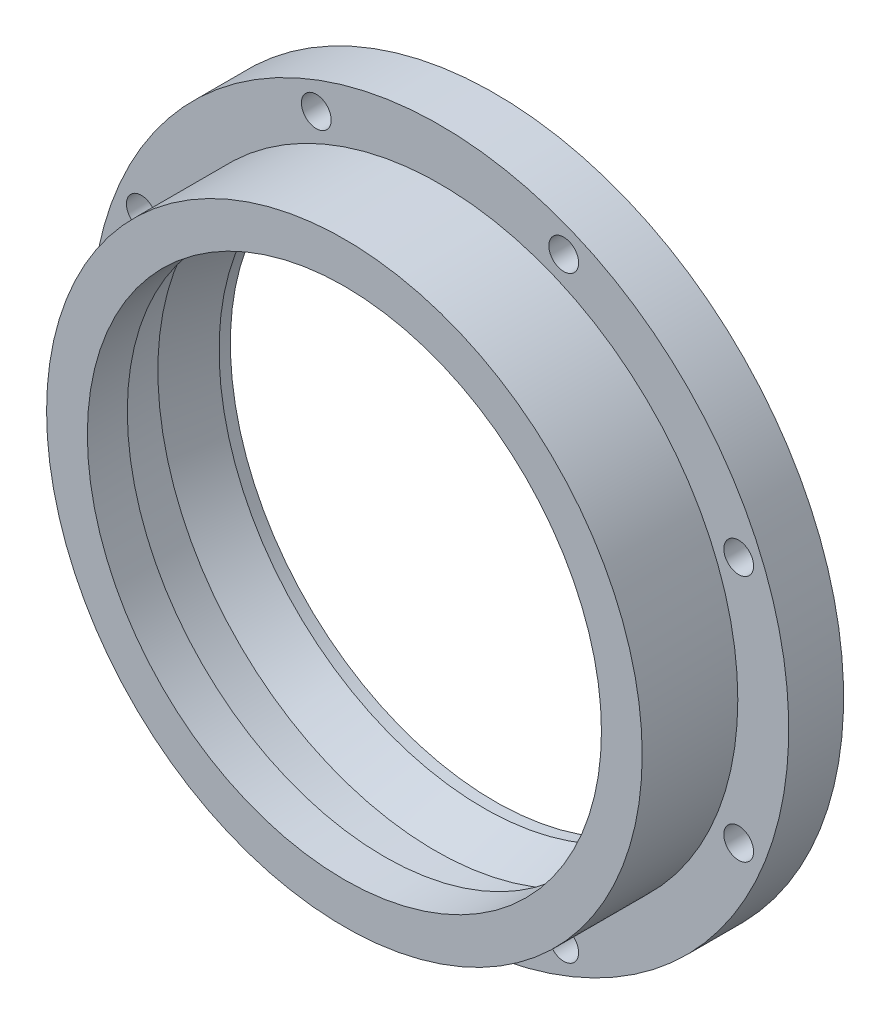
ISO-10303-21;
HEADER;
FILE_DESCRIPTION(('STEP AP214'),'2;1');
FILE_NAME('part.step','',(''),(''),'','','');
FILE_SCHEMA(('AUTOMOTIVE_DESIGN { 1 0 10303 214 1 1 1 1 }'));
ENDSEC;
DATA;
#1=APPLICATION_CONTEXT('core data for automotive mechanical design processes');
#2=APPLICATION_PROTOCOL_DEFINITION('international standard','automotive_design',2000,#1);
#3=PRODUCT_CONTEXT('',#1,'mechanical');
#4=PRODUCT('Part','Part','',(#3));
#5=PRODUCT_RELATED_PRODUCT_CATEGORY('part','',(#4));
#6=PRODUCT_DEFINITION_FORMATION('','',#4);
#7=PRODUCT_DEFINITION_CONTEXT('part definition',#1,'design');
#8=PRODUCT_DEFINITION('design','',#6,#7);
#9=PRODUCT_DEFINITION_SHAPE('','',#8);
#10=(LENGTH_UNIT() NAMED_UNIT(*) SI_UNIT(.MILLI.,.METRE.));
#11=(NAMED_UNIT(*) PLANE_ANGLE_UNIT() SI_UNIT($,.RADIAN.));
#12=(NAMED_UNIT(*) SI_UNIT($,.STERADIAN.) SOLID_ANGLE_UNIT());
#13=UNCERTAINTY_MEASURE_WITH_UNIT(LENGTH_MEASURE(1.E-05),#10,'distance_accuracy_value','');
#14=(GEOMETRIC_REPRESENTATION_CONTEXT(3) GLOBAL_UNCERTAINTY_ASSIGNED_CONTEXT((#13)) GLOBAL_UNIT_ASSIGNED_CONTEXT((#10,
#11,#12)) REPRESENTATION_CONTEXT('',''));
#15=CARTESIAN_POINT('',(0.,0.,0.));
#16=DIRECTION('',(0.,0.,1.));
#17=DIRECTION('',(1.,0.,0.));
#18=AXIS2_PLACEMENT_3D('',#15,#16,#17);
#19=CARTESIAN_POINT('',(41.656,0.,17.907));
#20=DIRECTION('',(0.,0.,1.));
#21=DIRECTION('',(1.,0.,0.));
#22=AXIS2_PLACEMENT_3D('',#19,#20,#21);
#23=PLANE('',#22);
#24=CARTESIAN_POINT('',(8.73989834802428E-13,0.,17.9070000000001));
#25=DIRECTION('',(0.,0.,1.));
#26=DIRECTION('',(1.,0.,0.));
#27=AXIS2_PLACEMENT_3D('',#24,#25,#26);
#28=CIRCLE('',#27,41.656);
#29=CARTESIAN_POINT('',(41.6560000000009,0.,17.907));
#30=VERTEX_POINT('',#29);
#31=EDGE_CURVE('E121',#30,#30,#28,.T.);
#32=ORIENTED_EDGE('',*,*,#31,.T.);
#33=EDGE_LOOP('',(#32));
#34=FACE_BOUND('',#33,.T.);
#35=CARTESIAN_POINT('',(9.66371887886218E-13,0.,17.9070000000001));
#36=DIRECTION('',(0.,0.,1.));
#37=DIRECTION('',(1.,0.,0.));
#38=AXIS2_PLACEMENT_3D('',#35,#36,#37);
#39=CIRCLE('',#38,43.18);
#40=CARTESIAN_POINT('',(43.180000000001,0.,17.907));
#41=VERTEX_POINT('',#40);
#42=EDGE_CURVE('E18',#41,#41,#39,.T.);
#43=ORIENTED_EDGE('',*,*,#42,.F.);
#44=EDGE_LOOP('',(#43));
#45=FACE_BOUND('',#44,.T.);
#46=ADVANCED_FACE('F15',(#34,#45),#23,.F.);
#47=CARTESIAN_POINT('',(3.49148133884313E-12,0.,1000.));
#48=DIRECTION('',(0.,0.,1.));
#49=DIRECTION('',(1.,0.,0.));
#50=AXIS2_PLACEMENT_3D('',#47,#48,#49);
#51=CYLINDRICAL_SURFACE('',#50,43.18);
#52=ORIENTED_EDGE('',*,*,#42,.T.);
#53=EDGE_LOOP('',(#52));
#54=FACE_BOUND('',#53,.T.);
#55=CARTESIAN_POINT('',(9.76167973397616E-13,0.,21.7170000000001));
#56=DIRECTION('',(0.,0.,1.));
#57=DIRECTION('',(1.,0.,0.));
#58=AXIS2_PLACEMENT_3D('',#55,#56,#57);
#59=CIRCLE('',#58,43.18);
#60=CARTESIAN_POINT('',(43.180000000001,0.,21.717));
#61=VERTEX_POINT('',#60);
#62=EDGE_CURVE('E118',#61,#61,#59,.F.);
#63=ORIENTED_EDGE('',*,*,#62,.T.);
#64=EDGE_LOOP('',(#63));
#65=FACE_BOUND('',#64,.T.);
#66=ADVANCED_FACE('F130',(#54,#65),#51,.T.);
#67=CARTESIAN_POINT('',(3.49148133884313E-12,0.,1000.));
#68=DIRECTION('',(0.,0.,1.));
#69=DIRECTION('',(1.,0.,0.));
#70=AXIS2_PLACEMENT_3D('',#67,#68,#69);
#71=CYLINDRICAL_SURFACE('',#70,41.656);
#72=ORIENTED_EDGE('',*,*,#31,.F.);
#73=EDGE_LOOP('',(#72));
#74=FACE_BOUND('',#73,.T.);
#75=CARTESIAN_POINT('',(8.91252448904832E-13,0.,24.3840000000001));
#76=DIRECTION('',(0.,0.,1.));
#77=DIRECTION('',(1.,0.,0.));
#78=AXIS2_PLACEMENT_3D('',#75,#76,#77);
#79=CIRCLE('',#78,41.656);
#80=CARTESIAN_POINT('',(41.6560000000009,0.,24.384));
#81=VERTEX_POINT('',#80);
#82=EDGE_CURVE('E114',#81,#81,#79,.F.);
#83=ORIENTED_EDGE('',*,*,#82,.F.);
#84=EDGE_LOOP('',(#83));
#85=FACE_BOUND('',#84,.T.);
#86=ADVANCED_FACE('F138',(#74,#85),#71,.F.);
#87=CARTESIAN_POINT('',(43.18,0.,21.717));
#88=DIRECTION('',(0.,0.,1.));
#89=DIRECTION('',(1.,0.,0.));
#90=AXIS2_PLACEMENT_3D('',#87,#88,#89);
#91=PLANE('',#90);
#92=ORIENTED_EDGE('',*,*,#62,.F.);
#93=EDGE_LOOP('',(#92));
#94=FACE_BOUND('',#93,.T.);
#95=CARTESIAN_POINT('',(1.0756436432175E-12,0.,21.7170000000001));
#96=DIRECTION('',(0.,0.,1.));
#97=DIRECTION('',(1.,0.,0.));
#98=AXIS2_PLACEMENT_3D('',#95,#96,#97);
#99=CIRCLE('',#98,44.958);
#100=CARTESIAN_POINT('',(44.9580000000011,0.,21.717));
#101=VERTEX_POINT('',#100);
#102=EDGE_CURVE('E110',#101,#101,#99,.F.);
#103=ORIENTED_EDGE('',*,*,#102,.T.);
#104=EDGE_LOOP('',(#103));
#105=FACE_BOUND('',#104,.T.);
#106=ADVANCED_FACE('F206',(#94,#105),#91,.F.);
#107=CARTESIAN_POINT('',(0.,0.,24.384));
#108=DIRECTION('',(0.,0.,1.));
#109=DIRECTION('',(1.,0.,0.));
#110=AXIS2_PLACEMENT_3D('',#107,#108,#109);
#111=PLANE('',#110);
#112=ORIENTED_EDGE('',*,*,#82,.T.);
#113=EDGE_LOOP('',(#112));
#114=FACE_BOUND('',#113,.T.);
#115=CARTESIAN_POINT('',(0.,0.,24.384));
#116=DIRECTION('',(0.,0.,1.));
#117=DIRECTION('',(1.,0.,0.));
#118=AXIS2_PLACEMENT_3D('',#115,#116,#117);
#119=CIRCLE('',#118,48.26);
#120=CARTESIAN_POINT('',(48.26,0.,24.384));
#121=VERTEX_POINT('',#120);
#122=EDGE_CURVE('E106',#121,#121,#119,.F.);
#123=ORIENTED_EDGE('',*,*,#122,.F.);
#124=EDGE_LOOP('',(#123));
#125=FACE_BOUND('',#124,.T.);
#126=ADVANCED_FACE('F202',(#114,#125),#111,.T.);
#127=CARTESIAN_POINT('',(3.49148133884313E-12,0.,1000.));
#128=DIRECTION('',(0.,0.,1.));
#129=DIRECTION('',(1.,0.,0.));
#130=AXIS2_PLACEMENT_3D('',#127,#128,#129);
#131=CYLINDRICAL_SURFACE('',#130,44.958);
#132=ORIENTED_EDGE('',*,*,#102,.F.);
#133=EDGE_LOOP('',(#132));
#134=FACE_BOUND('',#133,.T.);
#135=CARTESIAN_POINT('',(0.,0.,9.6520000000001));
#136=DIRECTION('',(0.,0.,1.));
#137=DIRECTION('',(1.,0.,0.));
#138=AXIS2_PLACEMENT_3D('',#135,#136,#137);
#139=CIRCLE('',#138,44.958);
#140=CARTESIAN_POINT('',(44.9580000000001,0.,9.65199999999993));
#141=VERTEX_POINT('',#140);
#142=EDGE_CURVE('E34',#141,#141,#139,.F.);
#143=ORIENTED_EDGE('',*,*,#142,.T.);
#144=EDGE_LOOP('',(#143));
#145=FACE_BOUND('',#144,.T.);
#146=ADVANCED_FACE('F198',(#134,#145),#131,.F.);
#147=CARTESIAN_POINT('',(0.,0.,1000.));
#148=DIRECTION('',(0.,0.,1.));
#149=DIRECTION('',(1.,0.,0.));
#150=AXIS2_PLACEMENT_3D('',#147,#148,#149);
#151=CYLINDRICAL_SURFACE('',#150,48.26);
#152=ORIENTED_EDGE('',*,*,#122,.T.);
#153=EDGE_LOOP('',(#152));
#154=FACE_BOUND('',#153,.T.);
#155=CARTESIAN_POINT('',(0.,0.,8.88999999999995));
#156=DIRECTION('',(0.,0.,1.));
#157=DIRECTION('',(1.,0.,0.));
#158=AXIS2_PLACEMENT_3D('',#155,#156,#157);
#159=CIRCLE('',#158,48.26);
#160=CARTESIAN_POINT('',(48.26,0.,8.88999999999995));
#161=VERTEX_POINT('',#160);
#162=EDGE_CURVE('E102',#161,#161,#159,.F.);
#163=ORIENTED_EDGE('',*,*,#162,.F.);
#164=EDGE_LOOP('',(#163));
#165=FACE_BOUND('',#164,.T.);
#166=ADVANCED_FACE('F194',(#154,#165),#151,.T.);
#167=CARTESIAN_POINT('',(0.,0.,9.65200000000009));
#168=DIRECTION('',(0.,0.,1.));
#169=DIRECTION('',(1.,0.,0.));
#170=AXIS2_PLACEMENT_3D('',#167,#168,#169);
#171=CONICAL_SURFACE('',#170,44.958,0.261799387799147);
#172=ORIENTED_EDGE('',*,*,#142,.F.);
#173=EDGE_LOOP('',(#172));
#174=FACE_BOUND('',#173,.T.);
#175=CARTESIAN_POINT('',(9.06028635438072E-13,0.,1.83148753273954));
#176=DIRECTION('',(0.,0.,1.));
#177=DIRECTION('',(1.,0.,0.));
#178=AXIS2_PLACEMENT_3D('',#175,#176,#177);
#179=CIRCLE('',#178,42.8625);
#180=CARTESIAN_POINT('',(42.8625000000009,0.,1.83148753273943));
#181=VERTEX_POINT('',#180);
#182=EDGE_CURVE('E97',#181,#181,#179,.F.);
#183=ORIENTED_EDGE('',*,*,#182,.T.);
#184=EDGE_LOOP('',(#183));
#185=FACE_BOUND('',#184,.T.);
#186=ADVANCED_FACE('F190',(#174,#185),#171,.F.);
#187=CARTESIAN_POINT('',(0.,56.515,8.89));
#188=DIRECTION('',(0.,0.,1.));
#189=DIRECTION('',(1.,0.,0.));
#190=AXIS2_PLACEMENT_3D('',#187,#188,#189);
#191=PLANE('',#190);
#192=ORIENTED_EDGE('',*,*,#162,.T.);
#193=EDGE_LOOP('',(#192));
#194=FACE_BOUND('',#193,.T.);
#195=CARTESIAN_POINT('',(-20.0478283130259,48.3997390094352,8.89));
#196=DIRECTION('',(0.,0.,-1.));
#197=DIRECTION('',(-1.,0.,0.));
#198=AXIS2_PLACEMENT_3D('',#195,#196,#197);
#199=CIRCLE('',#198,2.413);
#200=CARTESIAN_POINT('',(-22.4608283130258,48.3997390094352,8.89));
#201=VERTEX_POINT('',#200);
#202=EDGE_CURVE('E66',#201,#201,#199,.T.);
#203=ORIENTED_EDGE('',*,*,#202,.T.);
#204=EDGE_LOOP('',(#203));
#205=FACE_BOUND('',#204,.T.);
#206=CARTESIAN_POINT('',(-48.399739009435,20.0478283130264,8.89));
#207=DIRECTION('',(0.,0.,-1.));
#208=DIRECTION('',(-1.,0.,0.));
#209=AXIS2_PLACEMENT_3D('',#206,#207,#208);
#210=CIRCLE('',#209,2.413);
#211=CARTESIAN_POINT('',(-50.812739009435,20.0478283130264,8.89));
#212=VERTEX_POINT('',#211);
#213=EDGE_CURVE('E70',#212,#212,#210,.T.);
#214=ORIENTED_EDGE('',*,*,#213,.T.);
#215=EDGE_LOOP('',(#214));
#216=FACE_BOUND('',#215,.T.);
#217=CARTESIAN_POINT('',(-48.3997390094351,-20.047828313026,8.89));
#218=DIRECTION('',(0.,0.,-1.));
#219=DIRECTION('',(-1.,0.,0.));
#220=AXIS2_PLACEMENT_3D('',#217,#218,#219);
#221=CIRCLE('',#220,2.413);
#222=CARTESIAN_POINT('',(-50.8127390094351,-20.047828313026,8.89));
#223=VERTEX_POINT('',#222);
#224=EDGE_CURVE('E74',#223,#223,#221,.T.);
#225=ORIENTED_EDGE('',*,*,#224,.T.);
#226=EDGE_LOOP('',(#225));
#227=FACE_BOUND('',#226,.T.);
#228=CARTESIAN_POINT('',(-20.0478283130262,-48.399739009435,8.89));
#229=DIRECTION('',(0.,0.,-1.));
#230=DIRECTION('',(-1.,0.,0.));
#231=AXIS2_PLACEMENT_3D('',#228,#229,#230);
#232=CIRCLE('',#231,2.413);
#233=CARTESIAN_POINT('',(-22.4608283130262,-48.399739009435,8.89));
#234=VERTEX_POINT('',#233);
#235=EDGE_CURVE('E78',#234,#234,#232,.T.);
#236=ORIENTED_EDGE('',*,*,#235,.T.);
#237=EDGE_LOOP('',(#236));
#238=FACE_BOUND('',#237,.T.);
#239=CARTESIAN_POINT('',(20.0478283130259,-48.3997390094352,8.89));
#240=DIRECTION('',(0.,0.,-1.));
#241=DIRECTION('',(-1.,0.,0.));
#242=AXIS2_PLACEMENT_3D('',#239,#240,#241);
#243=CIRCLE('',#242,2.413);
#244=CARTESIAN_POINT('',(17.6348283130259,-48.3997390094352,8.89));
#245=VERTEX_POINT('',#244);
#246=EDGE_CURVE('E82',#245,#245,#243,.T.);
#247=ORIENTED_EDGE('',*,*,#246,.T.);
#248=EDGE_LOOP('',(#247));
#249=FACE_BOUND('',#248,.T.);
#250=CARTESIAN_POINT('',(48.3997390094351,-20.047828313026,8.89));
#251=DIRECTION('',(0.,0.,-1.));
#252=DIRECTION('',(-1.,0.,0.));
#253=AXIS2_PLACEMENT_3D('',#250,#251,#252);
#254=CIRCLE('',#253,2.413);
#255=CARTESIAN_POINT('',(45.9867390094351,-20.047828313026,8.89));
#256=VERTEX_POINT('',#255);
#257=EDGE_CURVE('E86',#256,#256,#254,.T.);
#258=ORIENTED_EDGE('',*,*,#257,.T.);
#259=EDGE_LOOP('',(#258));
#260=FACE_BOUND('',#259,.T.);
#261=CARTESIAN_POINT('',(48.3997390094349,20.0478283130264,8.89));
#262=DIRECTION('',(0.,0.,-1.));
#263=DIRECTION('',(-1.,0.,0.));
#264=AXIS2_PLACEMENT_3D('',#261,#262,#263);
#265=CIRCLE('',#264,2.413);
#266=CARTESIAN_POINT('',(45.9867390094349,20.0478283130264,8.89));
#267=VERTEX_POINT('',#266);
#268=EDGE_CURVE('E89',#267,#267,#265,.T.);
#269=ORIENTED_EDGE('',*,*,#268,.T.);
#270=EDGE_LOOP('',(#269));
#271=FACE_BOUND('',#270,.T.);
#272=CARTESIAN_POINT('',(20.0478283130259,48.3997390094352,8.89));
#273=DIRECTION('',(0.,0.,-1.));
#274=DIRECTION('',(-1.,0.,0.));
#275=AXIS2_PLACEMENT_3D('',#272,#273,#274);
#276=CIRCLE('',#275,2.413);
#277=CARTESIAN_POINT('',(17.6348283130259,48.3997390094352,8.89));
#278=VERTEX_POINT('',#277);
#279=EDGE_CURVE('E93',#278,#278,#276,.T.);
#280=ORIENTED_EDGE('',*,*,#279,.T.);
#281=EDGE_LOOP('',(#280));
#282=FACE_BOUND('',#281,.T.);
#283=CARTESIAN_POINT('',(0.,0.,8.89));
#284=DIRECTION('',(0.,0.,-1.));
#285=DIRECTION('',(-1.,0.,0.));
#286=AXIS2_PLACEMENT_3D('',#283,#284,#285);
#287=CIRCLE('',#286,56.515);
#288=CARTESIAN_POINT('',(-56.515,0.,8.89));
#289=VERTEX_POINT('',#288);
#290=EDGE_CURVE('E98',#289,#289,#287,.T.);
#291=ORIENTED_EDGE('',*,*,#290,.F.);
#292=EDGE_LOOP('',(#291));
#293=FACE_BOUND('',#292,.T.);
#294=ADVANCED_FACE('F186',(#194,#205,#216,#227,#238,#249,#260,#271,#282,#293),#191,.T.);
#295=CARTESIAN_POINT('',(0.,0.,24.384));
#296=DIRECTION('',(0.,0.,-1.));
#297=DIRECTION('',(-1.,0.,0.));
#298=AXIS2_PLACEMENT_3D('',#295,#296,#297);
#299=CYLINDRICAL_SURFACE('',#298,56.515);
#300=ORIENTED_EDGE('',*,*,#290,.T.);
#301=EDGE_LOOP('',(#300));
#302=FACE_BOUND('',#301,.T.);
#303=CARTESIAN_POINT('',(0.,0.,0.));
#304=DIRECTION('',(0.,0.,-1.));
#305=DIRECTION('',(-1.,0.,0.));
#306=AXIS2_PLACEMENT_3D('',#303,#304,#305);
#307=CIRCLE('',#306,56.515);
#308=CARTESIAN_POINT('',(-56.515,0.,0.));
#309=VERTEX_POINT('',#308);
#310=EDGE_CURVE('E62',#309,#309,#307,.F.);
#311=ORIENTED_EDGE('',*,*,#310,.T.);
#312=EDGE_LOOP('',(#311));
#313=FACE_BOUND('',#312,.T.);
#314=ADVANCED_FACE('F182',(#302,#313),#299,.T.);
#315=CARTESIAN_POINT('',(3.49148133884313E-12,0.,1000.));
#316=DIRECTION('',(0.,0.,1.));
#317=DIRECTION('',(1.,0.,0.));
#318=AXIS2_PLACEMENT_3D('',#315,#316,#317);
#319=CYLINDRICAL_SURFACE('',#318,42.8625);
#320=ORIENTED_EDGE('',*,*,#182,.F.);
#321=EDGE_LOOP('',(#320));
#322=FACE_BOUND('',#321,.T.);
#323=CARTESIAN_POINT('',(9.0128472262813E-13,0.,1.11022302462516E-13));
#324=DIRECTION('',(0.,0.,1.));
#325=DIRECTION('',(1.,0.,0.));
#326=AXIS2_PLACEMENT_3D('',#323,#324,#325);
#327=CIRCLE('',#326,42.8625);
#328=CARTESIAN_POINT('',(42.8625000000009,0.,0.));
#329=VERTEX_POINT('',#328);
#330=EDGE_CURVE('E58',#329,#329,#327,.F.);
#331=ORIENTED_EDGE('',*,*,#330,.T.);
#332=EDGE_LOOP('',(#331));
#333=FACE_BOUND('',#332,.T.);
#334=ADVANCED_FACE('F178',(#322,#333),#319,.F.);
#335=CARTESIAN_POINT('',(20.0478283130259,48.3997390094352,0.));
#336=DIRECTION('',(0.,0.,-1.));
#337=DIRECTION('',(-1.,0.,0.));
#338=AXIS2_PLACEMENT_3D('',#335,#336,#337);
#339=CYLINDRICAL_SURFACE('',#338,2.413);
#340=ORIENTED_EDGE('',*,*,#279,.F.);
#341=EDGE_LOOP('',(#340));
#342=FACE_BOUND('',#341,.T.);
#343=CARTESIAN_POINT('',(20.0478283130259,48.3997390094352,0.));
#344=DIRECTION('',(0.,0.,-1.));
#345=DIRECTION('',(-1.,0.,0.));
#346=AXIS2_PLACEMENT_3D('',#343,#344,#345);
#347=CIRCLE('',#346,2.413);
#348=CARTESIAN_POINT('',(17.6348283130259,48.3997390094352,0.));
#349=VERTEX_POINT('',#348);
#350=EDGE_CURVE('E55',#349,#349,#347,.T.);
#351=ORIENTED_EDGE('',*,*,#350,.T.);
#352=EDGE_LOOP('',(#351));
#353=FACE_BOUND('',#352,.T.);
#354=ADVANCED_FACE('F174',(#342,#353),#339,.F.);
#355=CARTESIAN_POINT('',(48.3997390094349,20.0478283130264,0.));
#356=DIRECTION('',(0.,0.,-1.));
#357=DIRECTION('',(-1.,0.,0.));
#358=AXIS2_PLACEMENT_3D('',#355,#356,#357);
#359=CYLINDRICAL_SURFACE('',#358,2.413);
#360=ORIENTED_EDGE('',*,*,#268,.F.);
#361=EDGE_LOOP('',(#360));
#362=FACE_BOUND('',#361,.T.);
#363=CARTESIAN_POINT('',(48.3997390094349,20.0478283130264,0.));
#364=DIRECTION('',(0.,0.,-1.));
#365=DIRECTION('',(-1.,0.,0.));
#366=AXIS2_PLACEMENT_3D('',#363,#364,#365);
#367=CIRCLE('',#366,2.413);
#368=CARTESIAN_POINT('',(45.9867390094349,20.0478283130264,0.));
#369=VERTEX_POINT('',#368);
#370=EDGE_CURVE('E51',#369,#369,#367,.T.);
#371=ORIENTED_EDGE('',*,*,#370,.T.);
#372=EDGE_LOOP('',(#371));
#373=FACE_BOUND('',#372,.T.);
#374=ADVANCED_FACE('F170',(#362,#373),#359,.F.);
#375=CARTESIAN_POINT('',(48.3997390094351,-20.047828313026,0.));
#376=DIRECTION('',(0.,0.,-1.));
#377=DIRECTION('',(-1.,0.,0.));
#378=AXIS2_PLACEMENT_3D('',#375,#376,#377);
#379=CYLINDRICAL_SURFACE('',#378,2.413);
#380=ORIENTED_EDGE('',*,*,#257,.F.);
#381=EDGE_LOOP('',(#380));
#382=FACE_BOUND('',#381,.T.);
#383=CARTESIAN_POINT('',(48.3997390094351,-20.047828313026,0.));
#384=DIRECTION('',(0.,0.,-1.));
#385=DIRECTION('',(-1.,0.,0.));
#386=AXIS2_PLACEMENT_3D('',#383,#384,#385);
#387=CIRCLE('',#386,2.413);
#388=CARTESIAN_POINT('',(45.9867390094351,-20.047828313026,0.));
#389=VERTEX_POINT('',#388);
#390=EDGE_CURVE('E48',#389,#389,#387,.T.);
#391=ORIENTED_EDGE('',*,*,#390,.T.);
#392=EDGE_LOOP('',(#391));
#393=FACE_BOUND('',#392,.T.);
#394=ADVANCED_FACE('F166',(#382,#393),#379,.F.);
#395=CARTESIAN_POINT('',(20.0478283130259,-48.3997390094352,0.));
#396=DIRECTION('',(0.,0.,-1.));
#397=DIRECTION('',(-1.,0.,0.));
#398=AXIS2_PLACEMENT_3D('',#395,#396,#397);
#399=CYLINDRICAL_SURFACE('',#398,2.413);
#400=ORIENTED_EDGE('',*,*,#246,.F.);
#401=EDGE_LOOP('',(#400));
#402=FACE_BOUND('',#401,.T.);
#403=CARTESIAN_POINT('',(20.0478283130259,-48.3997390094352,0.));
#404=DIRECTION('',(0.,0.,-1.));
#405=DIRECTION('',(-1.,0.,0.));
#406=AXIS2_PLACEMENT_3D('',#403,#404,#405);
#407=CIRCLE('',#406,2.413);
#408=CARTESIAN_POINT('',(17.6348283130259,-48.3997390094352,0.));
#409=VERTEX_POINT('',#408);
#410=EDGE_CURVE('E44',#409,#409,#407,.T.);
#411=ORIENTED_EDGE('',*,*,#410,.T.);
#412=EDGE_LOOP('',(#411));
#413=FACE_BOUND('',#412,.T.);
#414=ADVANCED_FACE('F162',(#402,#413),#399,.F.);
#415=CARTESIAN_POINT('',(-20.0478283130262,-48.399739009435,0.));
#416=DIRECTION('',(0.,0.,-1.));
#417=DIRECTION('',(-1.,0.,0.));
#418=AXIS2_PLACEMENT_3D('',#415,#416,#417);
#419=CYLINDRICAL_SURFACE('',#418,2.413);
#420=ORIENTED_EDGE('',*,*,#235,.F.);
#421=EDGE_LOOP('',(#420));
#422=FACE_BOUND('',#421,.T.);
#423=CARTESIAN_POINT('',(-20.0478283130262,-48.399739009435,0.));
#424=DIRECTION('',(0.,0.,-1.));
#425=DIRECTION('',(-1.,0.,0.));
#426=AXIS2_PLACEMENT_3D('',#423,#424,#425);
#427=CIRCLE('',#426,2.413);
#428=CARTESIAN_POINT('',(-22.4608283130262,-48.399739009435,0.));
#429=VERTEX_POINT('',#428);
#430=EDGE_CURVE('E40',#429,#429,#427,.T.);
#431=ORIENTED_EDGE('',*,*,#430,.T.);
#432=EDGE_LOOP('',(#431));
#433=FACE_BOUND('',#432,.T.);
#434=ADVANCED_FACE('F158',(#422,#433),#419,.F.);
#435=CARTESIAN_POINT('',(-48.3997390094351,-20.047828313026,0.));
#436=DIRECTION('',(0.,0.,-1.));
#437=DIRECTION('',(-1.,0.,0.));
#438=AXIS2_PLACEMENT_3D('',#435,#436,#437);
#439=CYLINDRICAL_SURFACE('',#438,2.413);
#440=ORIENTED_EDGE('',*,*,#224,.F.);
#441=EDGE_LOOP('',(#440));
#442=FACE_BOUND('',#441,.T.);
#443=CARTESIAN_POINT('',(-48.3997390094351,-20.047828313026,0.));
#444=DIRECTION('',(0.,0.,-1.));
#445=DIRECTION('',(-1.,0.,0.));
#446=AXIS2_PLACEMENT_3D('',#443,#444,#445);
#447=CIRCLE('',#446,2.413);
#448=CARTESIAN_POINT('',(-50.8127390094351,-20.047828313026,0.));
#449=VERTEX_POINT('',#448);
#450=EDGE_CURVE('E31',#449,#449,#447,.T.);
#451=ORIENTED_EDGE('',*,*,#450,.T.);
#452=EDGE_LOOP('',(#451));
#453=FACE_BOUND('',#452,.T.);
#454=ADVANCED_FACE('F154',(#442,#453),#439,.F.);
#455=CARTESIAN_POINT('',(-48.399739009435,20.0478283130264,0.));
#456=DIRECTION('',(0.,0.,-1.));
#457=DIRECTION('',(-1.,0.,0.));
#458=AXIS2_PLACEMENT_3D('',#455,#456,#457);
#459=CYLINDRICAL_SURFACE('',#458,2.413);
#460=ORIENTED_EDGE('',*,*,#213,.F.);
#461=EDGE_LOOP('',(#460));
#462=FACE_BOUND('',#461,.T.);
#463=CARTESIAN_POINT('',(-48.399739009435,20.0478283130264,0.));
#464=DIRECTION('',(0.,0.,-1.));
#465=DIRECTION('',(-1.,0.,0.));
#466=AXIS2_PLACEMENT_3D('',#463,#464,#465);
#467=CIRCLE('',#466,2.413);
#468=CARTESIAN_POINT('',(-50.812739009435,20.0478283130264,0.));
#469=VERTEX_POINT('',#468);
#470=EDGE_CURVE('E23',#469,#469,#467,.T.);
#471=ORIENTED_EDGE('',*,*,#470,.T.);
#472=EDGE_LOOP('',(#471));
#473=FACE_BOUND('',#472,.T.);
#474=ADVANCED_FACE('F147',(#462,#473),#459,.F.);
#475=CARTESIAN_POINT('',(-20.0478283130259,48.3997390094352,0.));
#476=DIRECTION('',(0.,0.,-1.));
#477=DIRECTION('',(-1.,0.,0.));
#478=AXIS2_PLACEMENT_3D('',#475,#476,#477);
#479=CYLINDRICAL_SURFACE('',#478,2.413);
#480=ORIENTED_EDGE('',*,*,#202,.F.);
#481=EDGE_LOOP('',(#480));
#482=FACE_BOUND('',#481,.T.);
#483=CARTESIAN_POINT('',(-20.0478283130259,48.3997390094352,0.));
#484=DIRECTION('',(0.,0.,-1.));
#485=DIRECTION('',(-1.,0.,0.));
#486=AXIS2_PLACEMENT_3D('',#483,#484,#485);
#487=CIRCLE('',#486,2.413);
#488=CARTESIAN_POINT('',(-22.4608283130258,48.3997390094352,0.));
#489=VERTEX_POINT('',#488);
#490=EDGE_CURVE('E10',#489,#489,#487,.T.);
#491=ORIENTED_EDGE('',*,*,#490,.T.);
#492=EDGE_LOOP('',(#491));
#493=FACE_BOUND('',#492,.T.);
#494=ADVANCED_FACE('F141',(#482,#493),#479,.F.);
#495=CARTESIAN_POINT('',(0.,0.,0.));
#496=DIRECTION('',(0.,0.,1.));
#497=DIRECTION('',(1.,0.,0.));
#498=AXIS2_PLACEMENT_3D('',#495,#496,#497);
#499=PLANE('',#498);
#500=ORIENTED_EDGE('',*,*,#490,.F.);
#501=EDGE_LOOP('',(#500));
#502=FACE_BOUND('',#501,.T.);
#503=ORIENTED_EDGE('',*,*,#470,.F.);
#504=EDGE_LOOP('',(#503));
#505=FACE_BOUND('',#504,.T.);
#506=ORIENTED_EDGE('',*,*,#450,.F.);
#507=EDGE_LOOP('',(#506));
#508=FACE_BOUND('',#507,.T.);
#509=ORIENTED_EDGE('',*,*,#430,.F.);
#510=EDGE_LOOP('',(#509));
#511=FACE_BOUND('',#510,.T.);
#512=ORIENTED_EDGE('',*,*,#410,.F.);
#513=EDGE_LOOP('',(#512));
#514=FACE_BOUND('',#513,.T.);
#515=ORIENTED_EDGE('',*,*,#390,.F.);
#516=EDGE_LOOP('',(#515));
#517=FACE_BOUND('',#516,.T.);
#518=ORIENTED_EDGE('',*,*,#370,.F.);
#519=EDGE_LOOP('',(#518));
#520=FACE_BOUND('',#519,.T.);
#521=ORIENTED_EDGE('',*,*,#350,.F.);
#522=EDGE_LOOP('',(#521));
#523=FACE_BOUND('',#522,.T.);
#524=ORIENTED_EDGE('',*,*,#330,.F.);
#525=EDGE_LOOP('',(#524));
#526=FACE_BOUND('',#525,.T.);
#527=ORIENTED_EDGE('',*,*,#310,.F.);
#528=EDGE_LOOP('',(#527));
#529=FACE_BOUND('',#528,.T.);
#530=ADVANCED_FACE('F139',(#502,#505,#508,#511,#514,#517,#520,#523,#526,#529),#499,.F.);
#531=CLOSED_SHELL('',(#46,#66,#86,#106,#126,#146,#166,#186,#294,#314,#334,#354,#374,#394,#414,
#434,#454,#474,#494,#530));
#532=MANIFOLD_SOLID_BREP('B1',#531);
#533=ADVANCED_BREP_SHAPE_REPRESENTATION('',(#18,#532),#14);
#534=SHAPE_DEFINITION_REPRESENTATION(#9,#533);
ENDSEC;
END-ISO-10303-21;
